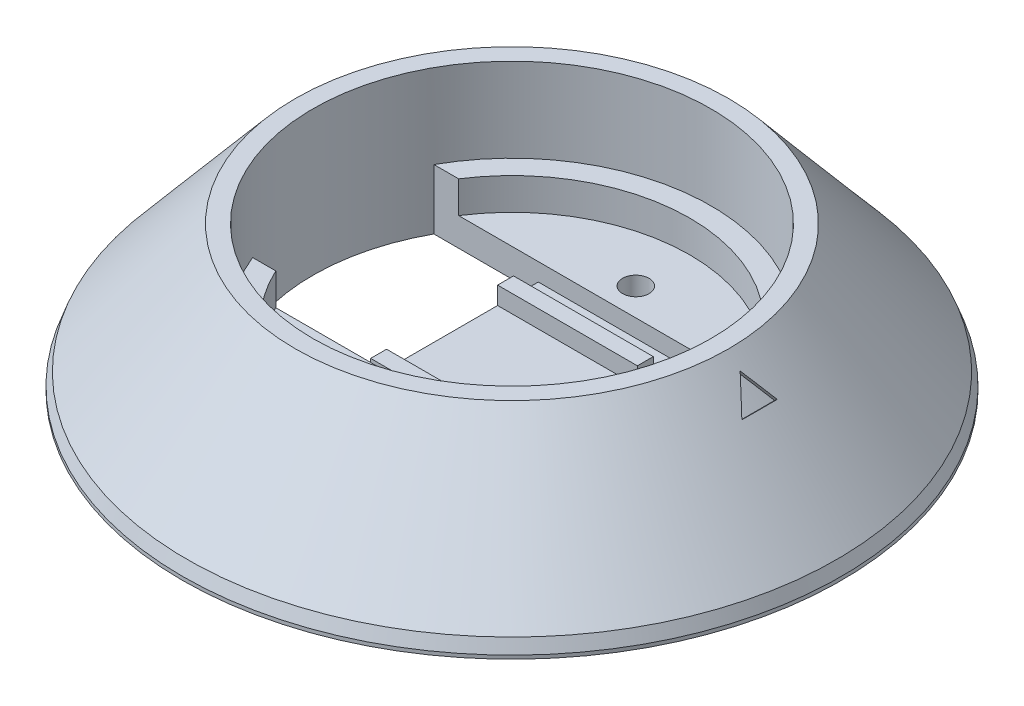
ISO-10303-21;
HEADER;
FILE_DESCRIPTION(('STEP AP214'),'2;1');
FILE_NAME('part.step','',(''),(''),'','','');
FILE_SCHEMA(('AUTOMOTIVE_DESIGN { 1 0 10303 214 1 1 1 1 }'));
ENDSEC;
DATA;
#1=APPLICATION_CONTEXT('core data for automotive mechanical design processes');
#2=APPLICATION_PROTOCOL_DEFINITION('international standard','automotive_design',2000,#1);
#3=PRODUCT_CONTEXT('',#1,'mechanical');
#4=PRODUCT('Part','Part','',(#3));
#5=PRODUCT_RELATED_PRODUCT_CATEGORY('part','',(#4));
#6=PRODUCT_DEFINITION_FORMATION('','',#4);
#7=PRODUCT_DEFINITION_CONTEXT('part definition',#1,'design');
#8=PRODUCT_DEFINITION('design','',#6,#7);
#9=PRODUCT_DEFINITION_SHAPE('','',#8);
#10=(LENGTH_UNIT() NAMED_UNIT(*) SI_UNIT(.MILLI.,.METRE.));
#11=(NAMED_UNIT(*) PLANE_ANGLE_UNIT() SI_UNIT($,.RADIAN.));
#12=(NAMED_UNIT(*) SI_UNIT($,.STERADIAN.) SOLID_ANGLE_UNIT());
#13=UNCERTAINTY_MEASURE_WITH_UNIT(LENGTH_MEASURE(1.E-05),#10,'distance_accuracy_value','');
#14=(GEOMETRIC_REPRESENTATION_CONTEXT(3) GLOBAL_UNCERTAINTY_ASSIGNED_CONTEXT((#13)) GLOBAL_UNIT_ASSIGNED_CONTEXT((#10,
#11,#12)) REPRESENTATION_CONTEXT('',''));
#15=CARTESIAN_POINT('',(0.,0.,0.));
#16=DIRECTION('',(0.,0.,1.));
#17=DIRECTION('',(1.,0.,0.));
#18=AXIS2_PLACEMENT_3D('',#15,#16,#17);
#19=CARTESIAN_POINT('',(0.,1.2,0.));
#20=DIRECTION('',(0.,1.,0.));
#21=DIRECTION('',(0.,0.,1.));
#22=AXIS2_PLACEMENT_3D('',#19,#20,#21);
#23=PLANE('',#22);
#24=DIRECTION('',(0.,0.,1.));
#25=VECTOR('',#24,1.);
#26=CARTESIAN_POINT('',(7.9,1.2,0.));
#27=LINE('',#26,#25);
#28=CARTESIAN_POINT('',(7.9,1.2,-10.875));
#29=VERTEX_POINT('',#28);
#30=CARTESIAN_POINT('',(7.9,1.2,-8.075));
#31=VERTEX_POINT('',#30);
#32=EDGE_CURVE('E489',#29,#31,#27,.T.);
#33=ORIENTED_EDGE('',*,*,#32,.F.);
#34=DIRECTION('',(1.,0.,0.));
#35=VECTOR('',#34,1.);
#36=CARTESIAN_POINT('',(0.,1.2,-10.875));
#37=LINE('',#36,#35);
#38=CARTESIAN_POINT('',(-7.9,1.2,-10.875));
#39=VERTEX_POINT('',#38);
#40=EDGE_CURVE('E386',#39,#29,#37,.T.);
#41=ORIENTED_EDGE('',*,*,#40,.F.);
#42=DIRECTION('',(0.,0.,1.));
#43=VECTOR('',#42,1.);
#44=CARTESIAN_POINT('',(-7.9,1.2,0.));
#45=LINE('',#44,#43);
#46=CARTESIAN_POINT('',(-7.9,1.2,-8.075));
#47=VERTEX_POINT('',#46);
#48=EDGE_CURVE('E437',#39,#47,#45,.T.);
#49=ORIENTED_EDGE('',*,*,#48,.T.);
#50=DIRECTION('',(1.,0.,0.));
#51=VECTOR('',#50,1.);
#52=CARTESIAN_POINT('',(0.,1.2,-8.075));
#53=LINE('',#52,#51);
#54=EDGE_CURVE('E379',#47,#31,#53,.T.);
#55=ORIENTED_EDGE('',*,*,#54,.T.);
#56=EDGE_LOOP('',(#33,#41,#49,#55));
#57=FACE_BOUND('',#56,.T.);
#58=ADVANCED_FACE('F74',(#57),#23,.T.);
#59=CARTESIAN_POINT('',(7.9,1.2,-6.275));
#60=VERTEX_POINT('',#59);
#61=CARTESIAN_POINT('',(7.9,1.2,6.275));
#62=VERTEX_POINT('',#61);
#63=EDGE_CURVE('E492',#60,#62,#27,.T.);
#64=ORIENTED_EDGE('',*,*,#63,.F.);
#65=DIRECTION('',(1.,0.,0.));
#66=VECTOR('',#65,1.);
#67=CARTESIAN_POINT('',(0.,1.2,-6.275));
#68=LINE('',#67,#66);
#69=CARTESIAN_POINT('',(-7.9,1.2,-6.275));
#70=VERTEX_POINT('',#69);
#71=EDGE_CURVE('E382',#70,#60,#68,.T.);
#72=ORIENTED_EDGE('',*,*,#71,.F.);
#73=CARTESIAN_POINT('',(-7.9,1.2,6.275));
#74=VERTEX_POINT('',#73);
#75=EDGE_CURVE('E441',#70,#74,#45,.T.);
#76=ORIENTED_EDGE('',*,*,#75,.T.);
#77=DIRECTION('',(1.,0.,0.));
#78=VECTOR('',#77,1.);
#79=CARTESIAN_POINT('',(-7.9,1.2,6.275));
#80=LINE('',#79,#78);
#81=EDGE_CURVE('E350',#74,#62,#80,.T.);
#82=ORIENTED_EDGE('',*,*,#81,.T.);
#83=EDGE_LOOP('',(#64,#72,#76,#82));
#84=FACE_BOUND('',#83,.T.);
#85=ADVANCED_FACE('F570',(#84),#23,.T.);
#86=CARTESIAN_POINT('',(0.,3.2,0.));
#87=DIRECTION('',(0.,1.,0.));
#88=DIRECTION('',(0.,0.,1.));
#89=AXIS2_PLACEMENT_3D('',#86,#87,#88);
#90=PLANE('',#89);
#91=DIRECTION('',(1.,0.,0.));
#92=VECTOR('',#91,1.);
#93=CARTESIAN_POINT('',(0.,3.2,-10.875));
#94=LINE('',#93,#92);
#95=CARTESIAN_POINT('',(-16.9039751242127,3.2,-10.875));
#96=VERTEX_POINT('',#95);
#97=CARTESIAN_POINT('',(16.9039751242126,3.2,-10.875));
#98=VERTEX_POINT('',#97);
#99=EDGE_CURVE('E396',#96,#98,#94,.T.);
#100=ORIENTED_EDGE('',*,*,#99,.T.);
#101=CARTESIAN_POINT('',(0.,3.2,0.));
#102=DIRECTION('',(0.,1.,0.));
#103=DIRECTION('',(0.,0.,1.));
#104=AXIS2_PLACEMENT_3D('',#101,#102,#103);
#105=CIRCLE('',#104,20.1);
#106=EDGE_CURVE('E334',#96,#98,#105,.F.);
#107=ORIENTED_EDGE('',*,*,#106,.F.);
#108=EDGE_LOOP('',(#100,#107));
#109=FACE_BOUND('',#108,.T.);
#110=CARTESIAN_POINT('',(0.,3.2,-14.));
#111=DIRECTION('',(0.,1.,0.));
#112=DIRECTION('',(0.,0.,1.));
#113=AXIS2_PLACEMENT_3D('',#110,#111,#112);
#114=CIRCLE('',#113,1.5);
#115=CARTESIAN_POINT('',(0.,3.2,-12.5));
#116=VERTEX_POINT('',#115);
#117=EDGE_CURVE('E480',#116,#116,#114,.T.);
#118=ORIENTED_EDGE('',*,*,#117,.F.);
#119=EDGE_LOOP('',(#118));
#120=FACE_BOUND('',#119,.T.);
#121=ADVANCED_FACE('F556',(#109,#120),#90,.T.);
#122=CARTESIAN_POINT('',(0.,6.8,0.));
#123=DIRECTION('',(0.,-1.,0.));
#124=DIRECTION('',(0.,0.,-1.));
#125=AXIS2_PLACEMENT_3D('',#122,#123,#124);
#126=CYLINDRICAL_SURFACE('',#125,20.1);
#127=DIRECTION('',(0.,-1.,0.));
#128=VECTOR('',#127,1.);
#129=CARTESIAN_POINT('',(16.9039751242126,6.8,-10.875));
#130=LINE('',#129,#128);
#131=CARTESIAN_POINT('',(16.9039751242126,6.8,-10.875));
#132=VERTEX_POINT('',#131);
#133=EDGE_CURVE('E477',#132,#98,#130,.T.);
#134=ORIENTED_EDGE('',*,*,#133,.F.);
#135=CARTESIAN_POINT('',(0.,6.8,0.));
#136=DIRECTION('',(0.,1.,0.));
#137=DIRECTION('',(0.,0.,1.));
#138=AXIS2_PLACEMENT_3D('',#135,#136,#137);
#139=CIRCLE('',#138,20.1);
#140=CARTESIAN_POINT('',(-16.9039751242127,6.8,-10.875));
#141=VERTEX_POINT('',#140);
#142=EDGE_CURVE('E329',#132,#141,#139,.T.);
#143=ORIENTED_EDGE('',*,*,#142,.T.);
#144=DIRECTION('',(0.,-1.,0.));
#145=VECTOR('',#144,1.);
#146=CARTESIAN_POINT('',(-16.9039751242127,6.8,-10.875));
#147=LINE('',#146,#145);
#148=EDGE_CURVE('E325',#96,#141,#147,.F.);
#149=ORIENTED_EDGE('',*,*,#148,.F.);
#150=ORIENTED_EDGE('',*,*,#106,.T.);
#151=EDGE_LOOP('',(#134,#143,#149,#150));
#152=FACE_BOUND('',#151,.T.);
#153=ADVANCED_FACE('F569',(#152),#126,.F.);
#154=CARTESIAN_POINT('',(0.,6.8,0.));
#155=DIRECTION('',(0.,1.,0.));
#156=DIRECTION('',(0.,0.,1.));
#157=AXIS2_PLACEMENT_3D('',#154,#155,#156);
#158=PLANE('',#157);
#159=DIRECTION('',(-1.,0.,0.));
#160=VECTOR('',#159,1.);
#161=CARTESIAN_POINT('',(7.9,6.8,-10.875));
#162=LINE('',#161,#160);
#163=CARTESIAN_POINT('',(19.6973189800033,6.8,-10.875));
#164=VERTEX_POINT('',#163);
#165=EDGE_CURVE('E253',#164,#132,#162,.T.);
#166=ORIENTED_EDGE('',*,*,#165,.F.);
#167=CARTESIAN_POINT('',(0.,6.8,0.));
#168=DIRECTION('',(0.,1.,0.));
#169=DIRECTION('',(0.,0.,1.));
#170=AXIS2_PLACEMENT_3D('',#167,#168,#169);
#171=CIRCLE('',#170,22.5);
#172=CARTESIAN_POINT('',(-19.6973189800033,6.8,-10.875));
#173=VERTEX_POINT('',#172);
#174=EDGE_CURVE('E326',#173,#164,#171,.F.);
#175=ORIENTED_EDGE('',*,*,#174,.F.);
#176=DIRECTION('',(-1.,0.,0.));
#177=VECTOR('',#176,1.);
#178=CARTESIAN_POINT('',(-7.9,6.8,-10.875));
#179=LINE('',#178,#177);
#180=EDGE_CURVE('E460',#141,#173,#179,.T.);
#181=ORIENTED_EDGE('',*,*,#180,.F.);
#182=ORIENTED_EDGE('',*,*,#142,.F.);
#183=EDGE_LOOP('',(#166,#175,#181,#182));
#184=FACE_BOUND('',#183,.T.);
#185=ADVANCED_FACE('F583',(#184),#158,.T.);
#186=CARTESIAN_POINT('',(7.9,1.2,8.075));
#187=VERTEX_POINT('',#186);
#188=CARTESIAN_POINT('',(7.9,1.2,8.475));
#189=VERTEX_POINT('',#188);
#190=EDGE_CURVE('E490',#187,#189,#27,.T.);
#191=ORIENTED_EDGE('',*,*,#190,.F.);
#192=DIRECTION('',(1.,0.,0.));
#193=VECTOR('',#192,1.);
#194=CARTESIAN_POINT('',(-7.9,1.2,8.075));
#195=LINE('',#194,#193);
#196=CARTESIAN_POINT('',(-7.9,1.2,8.075));
#197=VERTEX_POINT('',#196);
#198=EDGE_CURVE('E353',#197,#187,#195,.T.);
#199=ORIENTED_EDGE('',*,*,#198,.F.);
#200=CARTESIAN_POINT('',(-7.9,1.2,8.475));
#201=VERTEX_POINT('',#200);
#202=EDGE_CURVE('E438',#197,#201,#45,.T.);
#203=ORIENTED_EDGE('',*,*,#202,.T.);
#204=DIRECTION('',(1.,0.,0.));
#205=VECTOR('',#204,1.);
#206=CARTESIAN_POINT('',(0.,1.2,8.475));
#207=LINE('',#206,#205);
#208=EDGE_CURVE('E399',#201,#189,#207,.T.);
#209=ORIENTED_EDGE('',*,*,#208,.T.);
#210=EDGE_LOOP('',(#191,#199,#203,#209));
#211=FACE_BOUND('',#210,.T.);
#212=ADVANCED_FACE('F527',(#211),#23,.T.);
#213=CARTESIAN_POINT('',(0.,3.2,-10.875));
#214=DIRECTION('',(0.,0.,-1.));
#215=DIRECTION('',(-1.,0.,0.));
#216=AXIS2_PLACEMENT_3D('',#213,#214,#215);
#217=PLANE('',#216);
#218=ORIENTED_EDGE('',*,*,#40,.T.);
#219=DIRECTION('',(0.,1.,0.));
#220=VECTOR('',#219,1.);
#221=CARTESIAN_POINT('',(7.9,0.,-10.875));
#222=LINE('',#221,#220);
#223=CARTESIAN_POINT('',(7.9,0.,-10.875));
#224=VERTEX_POINT('',#223);
#225=EDGE_CURVE('E494',#224,#29,#222,.T.);
#226=ORIENTED_EDGE('',*,*,#225,.F.);
#227=DIRECTION('',(-1.,0.,0.));
#228=VECTOR('',#227,1.);
#229=CARTESIAN_POINT('',(7.9,0.,-10.875));
#230=LINE('',#229,#228);
#231=CARTESIAN_POINT('',(19.6973189800033,0.,-10.875));
#232=VERTEX_POINT('',#231);
#233=EDGE_CURVE('E266',#232,#224,#230,.T.);
#234=ORIENTED_EDGE('',*,*,#233,.F.);
#235=DIRECTION('',(0.,1.,0.));
#236=VECTOR('',#235,1.);
#237=CARTESIAN_POINT('',(19.6973189800033,0.,-10.875));
#238=LINE('',#237,#236);
#239=EDGE_CURVE('E493',#232,#164,#238,.T.);
#240=ORIENTED_EDGE('',*,*,#239,.T.);
#241=ORIENTED_EDGE('',*,*,#165,.T.);
#242=ORIENTED_EDGE('',*,*,#133,.T.);
#243=ORIENTED_EDGE('',*,*,#99,.F.);
#244=ORIENTED_EDGE('',*,*,#148,.T.);
#245=ORIENTED_EDGE('',*,*,#180,.T.);
#246=DIRECTION('',(0.,1.,0.));
#247=VECTOR('',#246,1.);
#248=CARTESIAN_POINT('',(-19.6973189800033,0.,-10.875));
#249=LINE('',#248,#247);
#250=CARTESIAN_POINT('',(-19.6973189800033,0.,-10.875));
#251=VERTEX_POINT('',#250);
#252=EDGE_CURVE('E446',#251,#173,#249,.T.);
#253=ORIENTED_EDGE('',*,*,#252,.F.);
#254=DIRECTION('',(-1.,0.,0.));
#255=VECTOR('',#254,1.);
#256=CARTESIAN_POINT('',(-7.9,0.,-10.875));
#257=LINE('',#256,#255);
#258=CARTESIAN_POINT('',(-7.9,0.,-10.875));
#259=VERTEX_POINT('',#258);
#260=EDGE_CURVE('E459',#259,#251,#257,.T.);
#261=ORIENTED_EDGE('',*,*,#260,.F.);
#262=DIRECTION('',(0.,1.,0.));
#263=VECTOR('',#262,1.);
#264=CARTESIAN_POINT('',(-7.9,0.,-10.875));
#265=LINE('',#264,#263);
#266=EDGE_CURVE('E445',#259,#39,#265,.T.);
#267=ORIENTED_EDGE('',*,*,#266,.T.);
#268=EDGE_LOOP('',(#218,#226,#234,#240,#241,#242,#243,#244,#245,#253,#261,#267));
#269=FACE_BOUND('',#268,.T.);
#270=ADVANCED_FACE('F515',(#269),#217,.F.);
#271=CARTESIAN_POINT('',(0.,3.2,8.475));
#272=DIRECTION('',(0.,0.,-1.));
#273=DIRECTION('',(-1.,0.,0.));
#274=AXIS2_PLACEMENT_3D('',#271,#272,#273);
#275=PLANE('',#274);
#276=DIRECTION('',(1.,0.,0.));
#277=VECTOR('',#276,1.);
#278=CARTESIAN_POINT('',(0.,3.2,8.475));
#279=LINE('',#278,#277);
#280=CARTESIAN_POINT('',(-18.2259259024062,3.2,8.475));
#281=VERTEX_POINT('',#280);
#282=CARTESIAN_POINT('',(18.2259259024062,3.2,8.475));
#283=VERTEX_POINT('',#282);
#284=EDGE_CURVE('E398',#281,#283,#279,.T.);
#285=ORIENTED_EDGE('',*,*,#284,.T.);
#286=DIRECTION('',(0.,-1.,0.));
#287=VECTOR('',#286,1.);
#288=CARTESIAN_POINT('',(18.2259259024062,6.8,8.475));
#289=LINE('',#288,#287);
#290=CARTESIAN_POINT('',(18.2259259024062,6.8,8.475));
#291=VERTEX_POINT('',#290);
#292=EDGE_CURVE('E487',#283,#291,#289,.F.);
#293=ORIENTED_EDGE('',*,*,#292,.T.);
#294=DIRECTION('',(1.,0.,0.));
#295=VECTOR('',#294,1.);
#296=CARTESIAN_POINT('',(20.8428494932915,6.8,8.475));
#297=LINE('',#296,#295);
#298=CARTESIAN_POINT('',(20.8428494932915,6.8,8.475));
#299=VERTEX_POINT('',#298);
#300=EDGE_CURVE('E255',#291,#299,#297,.T.);
#301=ORIENTED_EDGE('',*,*,#300,.T.);
#302=DIRECTION('',(0.,1.,0.));
#303=VECTOR('',#302,1.);
#304=CARTESIAN_POINT('',(20.8428494932915,0.,8.475));
#305=LINE('',#304,#303);
#306=CARTESIAN_POINT('',(20.8428494932915,0.,8.475));
#307=VERTEX_POINT('',#306);
#308=EDGE_CURVE('E102',#307,#299,#305,.T.);
#309=ORIENTED_EDGE('',*,*,#308,.F.);
#310=DIRECTION('',(1.,0.,0.));
#311=VECTOR('',#310,1.);
#312=CARTESIAN_POINT('',(20.8428494932915,0.,8.475));
#313=LINE('',#312,#311);
#314=CARTESIAN_POINT('',(7.9,0.,8.475));
#315=VERTEX_POINT('',#314);
#316=EDGE_CURVE('E505',#315,#307,#313,.T.);
#317=ORIENTED_EDGE('',*,*,#316,.F.);
#318=DIRECTION('',(0.,1.,0.));
#319=VECTOR('',#318,1.);
#320=CARTESIAN_POINT('',(7.9,0.,8.475));
#321=LINE('',#320,#319);
#322=EDGE_CURVE('E496',#315,#189,#321,.T.);
#323=ORIENTED_EDGE('',*,*,#322,.T.);
#324=ORIENTED_EDGE('',*,*,#208,.F.);
#325=DIRECTION('',(0.,1.,0.));
#326=VECTOR('',#325,1.);
#327=CARTESIAN_POINT('',(-7.9,0.,8.475));
#328=LINE('',#327,#326);
#329=CARTESIAN_POINT('',(-7.9,0.,8.475));
#330=VERTEX_POINT('',#329);
#331=EDGE_CURVE('E452',#330,#201,#328,.T.);
#332=ORIENTED_EDGE('',*,*,#331,.F.);
#333=DIRECTION('',(-1.,0.,0.));
#334=VECTOR('',#333,1.);
#335=CARTESIAN_POINT('',(-7.9,0.,8.475));
#336=LINE('',#335,#334);
#337=CARTESIAN_POINT('',(-20.8428494932915,0.,8.475));
#338=VERTEX_POINT('',#337);
#339=EDGE_CURVE('E465',#330,#338,#336,.T.);
#340=ORIENTED_EDGE('',*,*,#339,.T.);
#341=DIRECTION('',(0.,1.,0.));
#342=VECTOR('',#341,1.);
#343=CARTESIAN_POINT('',(-20.8428494932915,0.,8.475));
#344=LINE('',#343,#342);
#345=CARTESIAN_POINT('',(-20.8428494932915,6.8,8.475));
#346=VERTEX_POINT('',#345);
#347=EDGE_CURVE('E448',#338,#346,#344,.T.);
#348=ORIENTED_EDGE('',*,*,#347,.T.);
#349=DIRECTION('',(-1.,0.,0.));
#350=VECTOR('',#349,1.);
#351=CARTESIAN_POINT('',(-7.9,6.8,8.475));
#352=LINE('',#351,#350);
#353=CARTESIAN_POINT('',(-18.2259259024062,6.8,8.475));
#354=VERTEX_POINT('',#353);
#355=EDGE_CURVE('E456',#354,#346,#352,.T.);
#356=ORIENTED_EDGE('',*,*,#355,.F.);
#357=DIRECTION('',(0.,-1.,0.));
#358=VECTOR('',#357,1.);
#359=CARTESIAN_POINT('',(-18.2259259024062,6.8,8.475));
#360=LINE('',#359,#358);
#361=EDGE_CURVE('E442',#281,#354,#360,.F.);
#362=ORIENTED_EDGE('',*,*,#361,.F.);
#363=EDGE_LOOP('',(#285,#293,#301,#309,#317,#323,#324,#332,#340,#348,#356,#362));
#364=FACE_BOUND('',#363,.T.);
#365=ADVANCED_FACE('F524',(#364),#275,.T.);
#366=EDGE_CURVE('E333',#283,#281,#105,.F.);
#367=ORIENTED_EDGE('',*,*,#366,.F.);
#368=ORIENTED_EDGE('',*,*,#284,.F.);
#369=EDGE_LOOP('',(#367,#368));
#370=FACE_BOUND('',#369,.T.);
#371=CARTESIAN_POINT('',(0.,3.2,14.));
#372=DIRECTION('',(0.,1.,0.));
#373=DIRECTION('',(0.,0.,-1.));
#374=AXIS2_PLACEMENT_3D('',#371,#372,#373);
#375=CIRCLE('',#374,1.5);
#376=CARTESIAN_POINT('',(0.,3.2,15.5));
#377=VERTEX_POINT('',#376);
#378=EDGE_CURVE('E473',#377,#377,#375,.T.);
#379=ORIENTED_EDGE('',*,*,#378,.F.);
#380=EDGE_LOOP('',(#379));
#381=FACE_BOUND('',#380,.T.);
#382=ADVANCED_FACE('F551',(#370,#381),#90,.T.);
#383=CARTESIAN_POINT('',(0.,3.2,-6.275));
#384=DIRECTION('',(0.,0.,-1.));
#385=DIRECTION('',(-1.,0.,0.));
#386=AXIS2_PLACEMENT_3D('',#383,#384,#385);
#387=PLANE('',#386);
#388=ORIENTED_EDGE('',*,*,#71,.T.);
#389=DIRECTION('',(0.,-1.,0.));
#390=VECTOR('',#389,1.);
#391=CARTESIAN_POINT('',(7.9,3.2,-6.275));
#392=LINE('',#391,#390);
#393=CARTESIAN_POINT('',(7.9,3.2,-6.275));
#394=VERTEX_POINT('',#393);
#395=EDGE_CURVE('E357',#394,#60,#392,.T.);
#396=ORIENTED_EDGE('',*,*,#395,.F.);
#397=DIRECTION('',(1.,0.,0.));
#398=VECTOR('',#397,1.);
#399=CARTESIAN_POINT('',(0.,3.2,-6.275));
#400=LINE('',#399,#398);
#401=CARTESIAN_POINT('',(-7.9,3.2,-6.275));
#402=VERTEX_POINT('',#401);
#403=EDGE_CURVE('E383',#402,#394,#400,.T.);
#404=ORIENTED_EDGE('',*,*,#403,.F.);
#405=DIRECTION('',(0.,-1.,0.));
#406=VECTOR('',#405,1.);
#407=CARTESIAN_POINT('',(-7.9,3.2,-6.275));
#408=LINE('',#407,#406);
#409=EDGE_CURVE('E375',#402,#70,#408,.T.);
#410=ORIENTED_EDGE('',*,*,#409,.T.);
#411=EDGE_LOOP('',(#388,#396,#404,#410));
#412=FACE_BOUND('',#411,.T.);
#413=ADVANCED_FACE('F554',(#412),#387,.F.);
#414=CARTESIAN_POINT('',(7.9,3.2,0.));
#415=DIRECTION('',(-1.,0.,0.));
#416=DIRECTION('',(0.,0.,1.));
#417=AXIS2_PLACEMENT_3D('',#414,#415,#416);
#418=PLANE('',#417);
#419=ORIENTED_EDGE('',*,*,#395,.T.);
#420=ORIENTED_EDGE('',*,*,#63,.T.);
#421=DIRECTION('',(0.,-1.,0.));
#422=VECTOR('',#421,1.);
#423=CARTESIAN_POINT('',(7.9,3.2,6.275));
#424=LINE('',#423,#422);
#425=CARTESIAN_POINT('',(7.9,3.2,6.275));
#426=VERTEX_POINT('',#425);
#427=EDGE_CURVE('E343',#426,#62,#424,.T.);
#428=ORIENTED_EDGE('',*,*,#427,.F.);
#429=DIRECTION('',(0.,0.,1.));
#430=VECTOR('',#429,1.);
#431=CARTESIAN_POINT('',(7.9,3.2,6.275));
#432=LINE('',#431,#430);
#433=CARTESIAN_POINT('',(7.9,3.2,8.075));
#434=VERTEX_POINT('',#433);
#435=EDGE_CURVE('E360',#426,#434,#432,.T.);
#436=ORIENTED_EDGE('',*,*,#435,.T.);
#437=DIRECTION('',(0.,-1.,0.));
#438=VECTOR('',#437,1.);
#439=CARTESIAN_POINT('',(7.9,3.2,8.075));
#440=LINE('',#439,#438);
#441=EDGE_CURVE('E340',#434,#187,#440,.T.);
#442=ORIENTED_EDGE('',*,*,#441,.T.);
#443=ORIENTED_EDGE('',*,*,#190,.T.);
#444=ORIENTED_EDGE('',*,*,#322,.F.);
#445=DIRECTION('',(0.,0.,1.));
#446=VECTOR('',#445,1.);
#447=CARTESIAN_POINT('',(7.9,0.,-10.875));
#448=LINE('',#447,#446);
#449=EDGE_CURVE('E507',#224,#315,#448,.T.);
#450=ORIENTED_EDGE('',*,*,#449,.F.);
#451=ORIENTED_EDGE('',*,*,#225,.T.);
#452=ORIENTED_EDGE('',*,*,#32,.T.);
#453=DIRECTION('',(0.,-1.,0.));
#454=VECTOR('',#453,1.);
#455=CARTESIAN_POINT('',(7.9,3.2,-8.075));
#456=LINE('',#455,#454);
#457=CARTESIAN_POINT('',(7.9,3.2,-8.075));
#458=VERTEX_POINT('',#457);
#459=EDGE_CURVE('E369',#458,#31,#456,.T.);
#460=ORIENTED_EDGE('',*,*,#459,.F.);
#461=DIRECTION('',(0.,0.,-1.));
#462=VECTOR('',#461,1.);
#463=CARTESIAN_POINT('',(7.9,3.2,0.));
#464=LINE('',#463,#462);
#465=EDGE_CURVE('E392',#394,#458,#464,.T.);
#466=ORIENTED_EDGE('',*,*,#465,.F.);
#467=EDGE_LOOP('',(#419,#420,#428,#436,#442,#443,#444,#450,#451,#452,#460,#466));
#468=FACE_BOUND('',#467,.T.);
#469=ADVANCED_FACE('F521',(#468),#418,.F.);
#470=CARTESIAN_POINT('',(0.,3.2,-8.075));
#471=DIRECTION('',(0.,0.,-1.));
#472=DIRECTION('',(-1.,0.,0.));
#473=AXIS2_PLACEMENT_3D('',#470,#471,#472);
#474=PLANE('',#473);
#475=ORIENTED_EDGE('',*,*,#54,.F.);
#476=DIRECTION('',(0.,-1.,0.));
#477=VECTOR('',#476,1.);
#478=CARTESIAN_POINT('',(-7.9,3.2,-8.075));
#479=LINE('',#478,#477);
#480=CARTESIAN_POINT('',(-7.9,3.2,-8.075));
#481=VERTEX_POINT('',#480);
#482=EDGE_CURVE('E372',#481,#47,#479,.T.);
#483=ORIENTED_EDGE('',*,*,#482,.F.);
#484=DIRECTION('',(1.,0.,0.));
#485=VECTOR('',#484,1.);
#486=CARTESIAN_POINT('',(0.,3.2,-8.075));
#487=LINE('',#486,#485);
#488=EDGE_CURVE('E389',#481,#458,#487,.T.);
#489=ORIENTED_EDGE('',*,*,#488,.T.);
#490=ORIENTED_EDGE('',*,*,#459,.T.);
#491=EDGE_LOOP('',(#475,#483,#489,#490));
#492=FACE_BOUND('',#491,.T.);
#493=ADVANCED_FACE('F618',(#492),#474,.T.);
#494=CARTESIAN_POINT('',(-7.9,3.2,0.));
#495=DIRECTION('',(-1.,0.,0.));
#496=DIRECTION('',(0.,0.,1.));
#497=AXIS2_PLACEMENT_3D('',#494,#495,#496);
#498=PLANE('',#497);
#499=ORIENTED_EDGE('',*,*,#482,.T.);
#500=ORIENTED_EDGE('',*,*,#48,.F.);
#501=ORIENTED_EDGE('',*,*,#266,.F.);
#502=DIRECTION('',(0.,0.,1.));
#503=VECTOR('',#502,1.);
#504=CARTESIAN_POINT('',(-7.9,0.,-10.875));
#505=LINE('',#504,#503);
#506=EDGE_CURVE('E449',#259,#330,#505,.T.);
#507=ORIENTED_EDGE('',*,*,#506,.T.);
#508=ORIENTED_EDGE('',*,*,#331,.T.);
#509=ORIENTED_EDGE('',*,*,#202,.F.);
#510=DIRECTION('',(0.,-1.,0.));
#511=VECTOR('',#510,1.);
#512=CARTESIAN_POINT('',(-7.9,3.2,8.075));
#513=LINE('',#512,#511);
#514=CARTESIAN_POINT('',(-7.9,3.2,8.075));
#515=VERTEX_POINT('',#514);
#516=EDGE_CURVE('E337',#515,#197,#513,.T.);
#517=ORIENTED_EDGE('',*,*,#516,.F.);
#518=DIRECTION('',(0.,0.,1.));
#519=VECTOR('',#518,1.);
#520=CARTESIAN_POINT('',(-7.9,3.2,6.275));
#521=LINE('',#520,#519);
#522=CARTESIAN_POINT('',(-7.9,3.2,6.275));
#523=VERTEX_POINT('',#522);
#524=EDGE_CURVE('E354',#523,#515,#521,.T.);
#525=ORIENTED_EDGE('',*,*,#524,.F.);
#526=DIRECTION('',(0.,-1.,0.));
#527=VECTOR('',#526,1.);
#528=CARTESIAN_POINT('',(-7.9,3.2,6.275));
#529=LINE('',#528,#527);
#530=EDGE_CURVE('E346',#523,#74,#529,.T.);
#531=ORIENTED_EDGE('',*,*,#530,.T.);
#532=ORIENTED_EDGE('',*,*,#75,.F.);
#533=ORIENTED_EDGE('',*,*,#409,.F.);
#534=DIRECTION('',(0.,0.,-1.));
#535=VECTOR('',#534,1.);
#536=CARTESIAN_POINT('',(-7.9,3.2,0.));
#537=LINE('',#536,#535);
#538=EDGE_CURVE('E378',#402,#481,#537,.T.);
#539=ORIENTED_EDGE('',*,*,#538,.T.);
#540=EDGE_LOOP('',(#499,#500,#501,#507,#508,#509,#517,#525,#531,#532,#533,#539));
#541=FACE_BOUND('',#540,.T.);
#542=ADVANCED_FACE('F531',(#541),#498,.T.);
#543=CARTESIAN_POINT('',(0.,3.2,0.));
#544=DIRECTION('',(0.,1.,0.));
#545=DIRECTION('',(0.,0.,1.));
#546=AXIS2_PLACEMENT_3D('',#543,#544,#545);
#547=PLANE('',#546);
#548=ORIENTED_EDGE('',*,*,#403,.T.);
#549=ORIENTED_EDGE('',*,*,#465,.T.);
#550=ORIENTED_EDGE('',*,*,#488,.F.);
#551=ORIENTED_EDGE('',*,*,#538,.F.);
#552=EDGE_LOOP('',(#548,#549,#550,#551));
#553=FACE_BOUND('',#552,.T.);
#554=ADVANCED_FACE('F612',(#553),#547,.T.);
#555=CARTESIAN_POINT('',(-7.9,3.2,8.075));
#556=DIRECTION('',(0.,0.,-1.));
#557=DIRECTION('',(-1.,0.,0.));
#558=AXIS2_PLACEMENT_3D('',#555,#556,#557);
#559=PLANE('',#558);
#560=ORIENTED_EDGE('',*,*,#198,.T.);
#561=ORIENTED_EDGE('',*,*,#441,.F.);
#562=DIRECTION('',(1.,0.,0.));
#563=VECTOR('',#562,1.);
#564=CARTESIAN_POINT('',(-7.9,3.2,8.075));
#565=LINE('',#564,#563);
#566=EDGE_CURVE('E363',#515,#434,#565,.T.);
#567=ORIENTED_EDGE('',*,*,#566,.F.);
#568=ORIENTED_EDGE('',*,*,#516,.T.);
#569=EDGE_LOOP('',(#560,#561,#567,#568));
#570=FACE_BOUND('',#569,.T.);
#571=ADVANCED_FACE('F609',(#570),#559,.F.);
#572=CARTESIAN_POINT('',(-7.9,3.2,6.275));
#573=DIRECTION('',(0.,0.,-1.));
#574=DIRECTION('',(-1.,0.,0.));
#575=AXIS2_PLACEMENT_3D('',#572,#573,#574);
#576=PLANE('',#575);
#577=ORIENTED_EDGE('',*,*,#81,.F.);
#578=ORIENTED_EDGE('',*,*,#530,.F.);
#579=DIRECTION('',(1.,0.,0.));
#580=VECTOR('',#579,1.);
#581=CARTESIAN_POINT('',(-7.9,3.2,6.275));
#582=LINE('',#581,#580);
#583=EDGE_CURVE('E349',#523,#426,#582,.T.);
#584=ORIENTED_EDGE('',*,*,#583,.T.);
#585=ORIENTED_EDGE('',*,*,#427,.T.);
#586=EDGE_LOOP('',(#577,#578,#584,#585));
#587=FACE_BOUND('',#586,.T.);
#588=ADVANCED_FACE('F605',(#587),#576,.T.);
#589=CARTESIAN_POINT('',(0.,3.2,0.));
#590=DIRECTION('',(0.,1.,0.));
#591=DIRECTION('',(0.,0.,1.));
#592=AXIS2_PLACEMENT_3D('',#589,#590,#591);
#593=PLANE('',#592);
#594=ORIENTED_EDGE('',*,*,#524,.T.);
#595=ORIENTED_EDGE('',*,*,#566,.T.);
#596=ORIENTED_EDGE('',*,*,#435,.F.);
#597=ORIENTED_EDGE('',*,*,#583,.F.);
#598=EDGE_LOOP('',(#594,#595,#596,#597));
#599=FACE_BOUND('',#598,.T.);
#600=ADVANCED_FACE('F600',(#599),#593,.T.);
#601=ORIENTED_EDGE('',*,*,#292,.F.);
#602=ORIENTED_EDGE('',*,*,#366,.T.);
#603=ORIENTED_EDGE('',*,*,#361,.T.);
#604=EDGE_CURVE('E330',#354,#291,#139,.T.);
#605=ORIENTED_EDGE('',*,*,#604,.T.);
#606=EDGE_LOOP('',(#601,#602,#603,#605));
#607=FACE_BOUND('',#606,.T.);
#608=ADVANCED_FACE('F547',(#607),#126,.F.);
#609=ORIENTED_EDGE('',*,*,#300,.F.);
#610=ORIENTED_EDGE('',*,*,#604,.F.);
#611=ORIENTED_EDGE('',*,*,#355,.T.);
#612=EDGE_CURVE('E319',#299,#346,#171,.F.);
#613=ORIENTED_EDGE('',*,*,#612,.F.);
#614=EDGE_LOOP('',(#609,#610,#611,#613));
#615=FACE_BOUND('',#614,.T.);
#616=ADVANCED_FACE('F301',(#615),#158,.T.);
#617=CARTESIAN_POINT('',(0.,16.3,0.));
#618=DIRECTION('',(0.,1.,0.));
#619=DIRECTION('',(0.,0.,1.));
#620=AXIS2_PLACEMENT_3D('',#617,#618,#619);
#621=PLANE('',#620);
#622=CARTESIAN_POINT('',(0.,16.3,0.));
#623=DIRECTION('',(0.,1.,0.));
#624=DIRECTION('',(0.,0.,1.));
#625=AXIS2_PLACEMENT_3D('',#622,#623,#624);
#626=CIRCLE('',#625,22.5);
#627=CARTESIAN_POINT('',(0.,16.3,22.5));
#628=VERTEX_POINT('',#627);
#629=EDGE_CURVE('E320',#628,#628,#626,.F.);
#630=ORIENTED_EDGE('',*,*,#629,.T.);
#631=EDGE_LOOP('',(#630));
#632=FACE_BOUND('',#631,.T.);
#633=CARTESIAN_POINT('',(0.,16.3,0.));
#634=DIRECTION('',(0.,1.,0.));
#635=DIRECTION('',(0.,0.,1.));
#636=AXIS2_PLACEMENT_3D('',#633,#634,#635);
#637=CIRCLE('',#636,24.5);
#638=CARTESIAN_POINT('',(0.,16.3,24.5));
#639=VERTEX_POINT('',#638);
#640=EDGE_CURVE('E312',#639,#639,#637,.T.);
#641=ORIENTED_EDGE('',*,*,#640,.T.);
#642=EDGE_LOOP('',(#641));
#643=FACE_BOUND('',#642,.T.);
#644=ADVANCED_FACE('F298',(#632,#643),#621,.T.);
#645=CARTESIAN_POINT('',(0.,16.3,0.));
#646=DIRECTION('',(0.,-1.,0.));
#647=DIRECTION('',(0.,0.,-1.));
#648=AXIS2_PLACEMENT_3D('',#645,#646,#647);
#649=CONICAL_SURFACE('',#648,24.5,0.701216967539844);
#650=CARTESIAN_POINT('',(27.9836993737428,12.0896548297801,-2.00019999999999));
#651=CARTESIAN_POINT('',(27.8041351019331,12.3158438282706,-1.83353805270801));
#652=CARTESIAN_POINT('',(27.623823472477,12.5414311340102,-1.66686315640055));
#653=CARTESIAN_POINT('',(27.2616217778644,12.9913035890589,-1.33349985259006));
#654=CARTESIAN_POINT('',(27.0797317804834,13.2155887935971,-1.16681144596868));
#655=CARTESIAN_POINT('',(26.714273400043,13.6627787214926,-0.833418443834531));
#656=CARTESIAN_POINT('',(26.5307050087242,13.8856834380474,-0.666713848246103));
#657=CARTESIAN_POINT('',(26.1617805456536,14.3300182039802,-0.333289306627119));
#658=CARTESIAN_POINT('',(25.9764243978356,14.5514481899271,-0.166569360245009));
#659=CARTESIAN_POINT('',(25.7901271215382,14.7720847418107,0.000151127579210665));
#660=B_SPLINE_CURVE_WITH_KNOTS('',3,(#650,#651,#652,#653,#654,#655,#656,#657,#658,#659),
.UNSPECIFIED.,.F.,.F.,(4,2,2,2,4),(0.,1.00031417121082,2.00058559913616,3.00086195201459,
4.00118105439993),.UNSPECIFIED.);
#661=CARTESIAN_POINT('',(27.9834838916777,12.089926265246,-1.99999999999999));
#662=VERTEX_POINT('',#661);
#663=CARTESIAN_POINT('',(25.7902959961532,14.7718847418107,0.));
#664=VERTEX_POINT('',#663);
#665=EDGE_CURVE('E13',#662,#664,#660,.T.);
#666=ORIENTED_EDGE('',*,*,#665,.F.);
#667=CARTESIAN_POINT('',(-69.6105906659737,-70.3156664903868,0.));
#668=DIRECTION('',(0.645147998076611,-0.764057629094652,0.));
#669=DIRECTION('',(-0.764057629094652,-0.645147998076611,0.));
#670=AXIS2_PLACEMENT_3D('',#667,#668,#669);
#671=ELLIPSE('',#670,127.785838615286,68.4624301806467);
#672=CARTESIAN_POINT('',(27.9834838916777,12.089926265246,2.00000000000001));
#673=VERTEX_POINT('',#672);
#674=EDGE_CURVE('E88',#673,#662,#671,.F.);
#675=ORIENTED_EDGE('',*,*,#674,.F.);
#676=CARTESIAN_POINT('',(25.7901271215382,14.7720847418107,-0.000151127579196658));
#677=CARTESIAN_POINT('',(25.9764243978356,14.5514481899271,0.166569360245021));
#678=CARTESIAN_POINT('',(26.1617805456536,14.3300182039802,0.333289306627131));
#679=CARTESIAN_POINT('',(26.5307050087242,13.8856834380474,0.666713848246114));
#680=CARTESIAN_POINT('',(26.714273400043,13.6627787214926,0.833418443834542));
#681=CARTESIAN_POINT('',(27.0797317804834,13.2155887935971,1.16681144596869));
#682=CARTESIAN_POINT('',(27.2616217778644,12.9913035890589,1.33349985259008));
#683=CARTESIAN_POINT('',(27.623823472477,12.5414311340102,1.66686315640057));
#684=CARTESIAN_POINT('',(27.8041351019331,12.3158438282706,1.83353805270802));
#685=CARTESIAN_POINT('',(27.9836993737428,12.0896548297801,2.00020000000001));
#686=B_SPLINE_CURVE_WITH_KNOTS('',3,(#676,#677,#678,#679,#680,#681,#682,#683,#684,#685),
.UNSPECIFIED.,.F.,.F.,(4,2,2,2,4),(0.,1.00031910238534,2.00059545526377,3.00086688318911,
4.00118105439993),.UNSPECIFIED.);
#687=EDGE_CURVE('E250',#664,#673,#686,.T.);
#688=ORIENTED_EDGE('',*,*,#687,.F.);
#689=EDGE_LOOP('',(#666,#675,#688));
#690=FACE_BOUND('',#689,.T.);
#691=CARTESIAN_POINT('',(0.,1.80611117316146,0.));
#692=DIRECTION('',(0.,-1.,0.));
#693=DIRECTION('',(0.,0.,-1.));
#694=AXIS2_PLACEMENT_3D('',#691,#692,#693);
#695=CIRCLE('',#694,36.7382173869001);
#696=CARTESIAN_POINT('',(0.,1.80611117316146,-36.7382173869001));
#697=VERTEX_POINT('',#696);
#698=EDGE_CURVE('E408',#697,#697,#695,.F.);
#699=ORIENTED_EDGE('',*,*,#698,.T.);
#700=EDGE_LOOP('',(#699));
#701=FACE_BOUND('',#700,.T.);
#702=ORIENTED_EDGE('',*,*,#640,.F.);
#703=EDGE_LOOP('',(#702));
#704=FACE_BOUND('',#703,.T.);
#705=ADVANCED_FACE('F297',(#690,#701,#704),#649,.T.);
#706=CARTESIAN_POINT('',(0.,16.3001,0.));
#707=DIRECTION('',(0.,-1.,0.));
#708=DIRECTION('',(0.,0.,-1.));
#709=AXIS2_PLACEMENT_3D('',#706,#707,#708);
#710=CYLINDRICAL_SURFACE('',#709,22.5);
#711=ORIENTED_EDGE('',*,*,#174,.T.);
#712=ORIENTED_EDGE('',*,*,#239,.F.);
#713=CARTESIAN_POINT('',(0.,0.,0.));
#714=DIRECTION('',(0.,1.,0.));
#715=DIRECTION('',(0.,0.,1.));
#716=AXIS2_PLACEMENT_3D('',#713,#714,#715);
#717=CIRCLE('',#716,22.5);
#718=EDGE_CURVE('E497',#307,#232,#717,.T.);
#719=ORIENTED_EDGE('',*,*,#718,.F.);
#720=ORIENTED_EDGE('',*,*,#308,.T.);
#721=ORIENTED_EDGE('',*,*,#612,.T.);
#722=ORIENTED_EDGE('',*,*,#347,.F.);
#723=CARTESIAN_POINT('',(0.,0.,0.));
#724=DIRECTION('',(0.,1.,0.));
#725=DIRECTION('',(0.,0.,1.));
#726=AXIS2_PLACEMENT_3D('',#723,#724,#725);
#727=CIRCLE('',#726,22.5);
#728=EDGE_CURVE('E468',#251,#338,#727,.T.);
#729=ORIENTED_EDGE('',*,*,#728,.F.);
#730=ORIENTED_EDGE('',*,*,#252,.T.);
#731=EDGE_LOOP('',(#711,#712,#719,#720,#721,#722,#729,#730));
#732=FACE_BOUND('',#731,.T.);
#733=ORIENTED_EDGE('',*,*,#629,.F.);
#734=EDGE_LOOP('',(#733));
#735=FACE_BOUND('',#734,.T.);
#736=ADVANCED_FACE('F293',(#732,#735),#710,.F.);
#737=CARTESIAN_POINT('',(0.,0.,0.));
#738=DIRECTION('',(0.,1.,0.));
#739=DIRECTION('',(0.,0.,1.));
#740=AXIS2_PLACEMENT_3D('',#737,#738,#739);
#741=PLANE('',#740);
#742=ORIENTED_EDGE('',*,*,#718,.T.);
#743=ORIENTED_EDGE('',*,*,#233,.T.);
#744=ORIENTED_EDGE('',*,*,#449,.T.);
#745=ORIENTED_EDGE('',*,*,#316,.T.);
#746=EDGE_LOOP('',(#742,#743,#744,#745));
#747=FACE_BOUND('',#746,.T.);
#748=CARTESIAN_POINT('',(0.,0.,-14.));
#749=DIRECTION('',(0.,1.,0.));
#750=DIRECTION('',(0.,0.,1.));
#751=AXIS2_PLACEMENT_3D('',#748,#749,#750);
#752=CIRCLE('',#751,1.5);
#753=CARTESIAN_POINT('',(0.,0.,-12.5));
#754=VERTEX_POINT('',#753);
#755=EDGE_CURVE('E463',#754,#754,#752,.T.);
#756=ORIENTED_EDGE('',*,*,#755,.T.);
#757=EDGE_LOOP('',(#756));
#758=FACE_BOUND('',#757,.T.);
#759=CARTESIAN_POINT('',(0.,0.,14.));
#760=DIRECTION('',(0.,1.,0.));
#761=DIRECTION('',(0.,0.,-1.));
#762=AXIS2_PLACEMENT_3D('',#759,#760,#761);
#763=CIRCLE('',#762,1.5);
#764=CARTESIAN_POINT('',(0.,0.,15.5));
#765=VERTEX_POINT('',#764);
#766=EDGE_CURVE('E476',#765,#765,#763,.T.);
#767=ORIENTED_EDGE('',*,*,#766,.T.);
#768=EDGE_LOOP('',(#767));
#769=FACE_BOUND('',#768,.T.);
#770=ORIENTED_EDGE('',*,*,#506,.F.);
#771=ORIENTED_EDGE('',*,*,#260,.T.);
#772=ORIENTED_EDGE('',*,*,#728,.T.);
#773=ORIENTED_EDGE('',*,*,#339,.F.);
#774=EDGE_LOOP('',(#770,#771,#772,#773));
#775=FACE_BOUND('',#774,.T.);
#776=CARTESIAN_POINT('',(0.,0.,0.));
#777=DIRECTION('',(0.,1.,0.));
#778=DIRECTION('',(0.,0.,1.));
#779=AXIS2_PLACEMENT_3D('',#776,#777,#778);
#780=CIRCLE('',#779,37.25);
#781=CARTESIAN_POINT('',(0.,0.,37.25));
#782=VERTEX_POINT('',#781);
#783=EDGE_CURVE('E401',#782,#782,#780,.T.);
#784=ORIENTED_EDGE('',*,*,#783,.F.);
#785=EDGE_LOOP('',(#784));
#786=FACE_BOUND('',#785,.T.);
#787=ADVANCED_FACE('F296',(#747,#758,#769,#775,#786),#741,.F.);
#788=CARTESIAN_POINT('',(0.,1.2,0.));
#789=DIRECTION('',(0.,-1.,0.));
#790=DIRECTION('',(0.,0.,-1.));
#791=AXIS2_PLACEMENT_3D('',#788,#789,#790);
#792=CYLINDRICAL_SURFACE('',#791,37.25);
#793=CARTESIAN_POINT('',(0.,0.399999999999953,0.));
#794=DIRECTION('',(0.,1.,0.));
#795=DIRECTION('',(0.,0.,1.));
#796=AXIS2_PLACEMENT_3D('',#793,#794,#795);
#797=CIRCLE('',#796,37.25);
#798=CARTESIAN_POINT('',(0.,0.399999999999953,37.25));
#799=VERTEX_POINT('',#798);
#800=EDGE_CURVE('E411',#799,#799,#797,.F.);
#801=ORIENTED_EDGE('',*,*,#800,.T.);
#802=EDGE_LOOP('',(#801));
#803=FACE_BOUND('',#802,.T.);
#804=ORIENTED_EDGE('',*,*,#783,.T.);
#805=EDGE_LOOP('',(#804));
#806=FACE_BOUND('',#805,.T.);
#807=ADVANCED_FACE('F291',(#803,#806),#792,.T.);
#808=CARTESIAN_POINT('',(0.,0.,14.));
#809=DIRECTION('',(0.,1.,0.));
#810=DIRECTION('',(0.,0.,1.));
#811=AXIS2_PLACEMENT_3D('',#808,#809,#810);
#812=CYLINDRICAL_SURFACE('',#811,1.5);
#813=CARTESIAN_POINT('',(0.,0.,15.5));
#814=CARTESIAN_POINT('',(0.,0.0333333333333333,15.5));
#815=CARTESIAN_POINT('',(0.,0.0666666666666666,15.5));
#816=CARTESIAN_POINT('',(0.,0.133333333333333,15.5));
#817=CARTESIAN_POINT('',(0.,0.166666666666667,15.5));
#818=CARTESIAN_POINT('',(0.,0.233333333333333,15.5));
#819=CARTESIAN_POINT('',(0.,0.266666666666667,15.5));
#820=CARTESIAN_POINT('',(0.,0.333333333333333,15.5));
#821=CARTESIAN_POINT('',(0.,0.366666666666667,15.5));
#822=CARTESIAN_POINT('',(0.,0.433333333333333,15.5));
#823=CARTESIAN_POINT('',(0.,0.466666666666667,15.5));
#824=CARTESIAN_POINT('',(0.,0.533333333333333,15.5));
#825=CARTESIAN_POINT('',(0.,0.566666666666667,15.5));
#826=CARTESIAN_POINT('',(0.,0.633333333333333,15.5));
#827=CARTESIAN_POINT('',(0.,0.666666666666666,15.5));
#828=CARTESIAN_POINT('',(0.,0.733333333333333,15.5));
#829=CARTESIAN_POINT('',(0.,0.766666666666666,15.5));
#830=CARTESIAN_POINT('',(0.,0.833333333333333,15.5));
#831=CARTESIAN_POINT('',(0.,0.866666666666666,15.5));
#832=CARTESIAN_POINT('',(0.,0.933333333333333,15.5));
#833=CARTESIAN_POINT('',(0.,0.966666666666666,15.5));
#834=CARTESIAN_POINT('',(0.,1.03333333333333,15.5));
#835=CARTESIAN_POINT('',(0.,1.06666666666667,15.5));
#836=CARTESIAN_POINT('',(0.,1.13333333333333,15.5));
#837=CARTESIAN_POINT('',(0.,1.16666666666667,15.5));
#838=CARTESIAN_POINT('',(0.,1.23333333333333,15.5));
#839=CARTESIAN_POINT('',(0.,1.26666666666667,15.5));
#840=CARTESIAN_POINT('',(0.,1.33333333333333,15.5));
#841=CARTESIAN_POINT('',(0.,1.36666666666667,15.5));
#842=CARTESIAN_POINT('',(0.,1.43333333333333,15.5));
#843=CARTESIAN_POINT('',(0.,1.46666666666667,15.5));
#844=CARTESIAN_POINT('',(0.,1.53333333333333,15.5));
#845=CARTESIAN_POINT('',(0.,1.56666666666667,15.5));
#846=CARTESIAN_POINT('',(0.,1.63333333333333,15.5));
#847=CARTESIAN_POINT('',(0.,1.66666666666667,15.5));
#848=CARTESIAN_POINT('',(0.,1.73333333333333,15.5));
#849=CARTESIAN_POINT('',(0.,1.76666666666667,15.5));
#850=CARTESIAN_POINT('',(0.,1.83333333333333,15.5));
#851=CARTESIAN_POINT('',(0.,1.86666666666667,15.5));
#852=CARTESIAN_POINT('',(0.,1.93333333333333,15.5));
#853=CARTESIAN_POINT('',(0.,1.96666666666667,15.5));
#854=CARTESIAN_POINT('',(0.,2.03333333333333,15.5));
#855=CARTESIAN_POINT('',(0.,2.06666666666667,15.5));
#856=CARTESIAN_POINT('',(0.,2.13333333333333,15.5));
#857=CARTESIAN_POINT('',(0.,2.16666666666667,15.5));
#858=CARTESIAN_POINT('',(0.,2.23333333333333,15.5));
#859=CARTESIAN_POINT('',(0.,2.26666666666667,15.5));
#860=CARTESIAN_POINT('',(0.,2.33333333333333,15.5));
#861=CARTESIAN_POINT('',(0.,2.36666666666667,15.5));
#862=CARTESIAN_POINT('',(0.,2.43333333333333,15.5));
#863=CARTESIAN_POINT('',(0.,2.46666666666667,15.5));
#864=CARTESIAN_POINT('',(0.,2.53333333333333,15.5));
#865=CARTESIAN_POINT('',(0.,2.56666666666667,15.5));
#866=CARTESIAN_POINT('',(0.,2.63333333333333,15.5));
#867=CARTESIAN_POINT('',(0.,2.66666666666667,15.5));
#868=CARTESIAN_POINT('',(0.,2.73333333333333,15.5));
#869=CARTESIAN_POINT('',(0.,2.76666666666667,15.5));
#870=CARTESIAN_POINT('',(0.,2.83333333333333,15.5));
#871=CARTESIAN_POINT('',(0.,2.86666666666667,15.5));
#872=CARTESIAN_POINT('',(0.,2.93333333333333,15.5));
#873=CARTESIAN_POINT('',(0.,2.96666666666667,15.5));
#874=CARTESIAN_POINT('',(0.,3.03333333333333,15.5));
#875=CARTESIAN_POINT('',(0.,3.06666666666667,15.5));
#876=CARTESIAN_POINT('',(0.,3.13333333333333,15.5));
#877=CARTESIAN_POINT('',(0.,3.16666666666667,15.5));
#878=CARTESIAN_POINT('',(0.,3.2,15.5));
#879=B_SPLINE_CURVE_WITH_KNOTS('',3,(#813,#814,#815,#816,#817,#818,#819,#820,#821,#822,#823,
#824,#825,#826,#827,#828,#829,#830,#831,#832,#833,#834,#835,#836,#837,#838,#839,#840,#841,#842,
#843,#844,#845,#846,#847,#848,#849,#850,#851,#852,#853,#854,#855,#856,#857,#858,#859,#860,#861,
#862,#863,#864,#865,#866,#867,#868,#869,#870,#871,#872,#873,#874,#875,#876,#877,#878),
.UNSPECIFIED.,.F.,.F.,(4,2,2,2,2,2,2,2,2,2,2,2,2,2,2,2,2,2,2,2,2,2,2,2,2,2,2,2,2,2,2,2,4),(0.,
0.1,0.2,0.3,0.4,0.5,0.6,0.7,0.8,0.9,1.,1.1,1.2,1.3,1.4,1.5,1.6,1.7,1.8,1.9,2.,2.1,2.2,2.3,2.4,
2.5,2.6,2.7,2.8,2.9,3.,3.1,3.2),.UNSPECIFIED.);
#880=EDGE_CURVE('BSEAM287',#765,#377,#879,.T.);
#881=ORIENTED_EDGE('',*,*,#766,.F.);
#882=ORIENTED_EDGE('',*,*,#378,.T.);
#883=ORIENTED_EDGE('',*,*,#880,.T.);
#884=ORIENTED_EDGE('',*,*,#880,.F.);
#885=EDGE_LOOP('',(#881,#883,#882,#884));
#886=FACE_BOUND('',#885,.T.);
#887=ADVANCED_FACE('F287',(#886),#812,.F.);
#888=CARTESIAN_POINT('',(0.,0.,-14.));
#889=DIRECTION('',(0.,1.,0.));
#890=DIRECTION('',(0.,0.,1.));
#891=AXIS2_PLACEMENT_3D('',#888,#889,#890);
#892=CYLINDRICAL_SURFACE('',#891,1.5);
#893=CARTESIAN_POINT('',(0.,0.,-12.5));
#894=CARTESIAN_POINT('',(0.,0.0333333333333333,-12.5));
#895=CARTESIAN_POINT('',(0.,0.0666666666666666,-12.5));
#896=CARTESIAN_POINT('',(0.,0.133333333333333,-12.5));
#897=CARTESIAN_POINT('',(0.,0.166666666666667,-12.5));
#898=CARTESIAN_POINT('',(0.,0.233333333333333,-12.5));
#899=CARTESIAN_POINT('',(0.,0.266666666666667,-12.5));
#900=CARTESIAN_POINT('',(0.,0.333333333333333,-12.5));
#901=CARTESIAN_POINT('',(0.,0.366666666666667,-12.5));
#902=CARTESIAN_POINT('',(0.,0.433333333333333,-12.5));
#903=CARTESIAN_POINT('',(0.,0.466666666666667,-12.5));
#904=CARTESIAN_POINT('',(0.,0.533333333333333,-12.5));
#905=CARTESIAN_POINT('',(0.,0.566666666666667,-12.5));
#906=CARTESIAN_POINT('',(0.,0.633333333333333,-12.5));
#907=CARTESIAN_POINT('',(0.,0.666666666666666,-12.5));
#908=CARTESIAN_POINT('',(0.,0.733333333333333,-12.5));
#909=CARTESIAN_POINT('',(0.,0.766666666666666,-12.5));
#910=CARTESIAN_POINT('',(0.,0.833333333333333,-12.5));
#911=CARTESIAN_POINT('',(0.,0.866666666666666,-12.5));
#912=CARTESIAN_POINT('',(0.,0.933333333333333,-12.5));
#913=CARTESIAN_POINT('',(0.,0.966666666666666,-12.5));
#914=CARTESIAN_POINT('',(0.,1.03333333333333,-12.5));
#915=CARTESIAN_POINT('',(0.,1.06666666666667,-12.5));
#916=CARTESIAN_POINT('',(0.,1.13333333333333,-12.5));
#917=CARTESIAN_POINT('',(0.,1.16666666666667,-12.5));
#918=CARTESIAN_POINT('',(0.,1.23333333333333,-12.5));
#919=CARTESIAN_POINT('',(0.,1.26666666666667,-12.5));
#920=CARTESIAN_POINT('',(0.,1.33333333333333,-12.5));
#921=CARTESIAN_POINT('',(0.,1.36666666666667,-12.5));
#922=CARTESIAN_POINT('',(0.,1.43333333333333,-12.5));
#923=CARTESIAN_POINT('',(0.,1.46666666666667,-12.5));
#924=CARTESIAN_POINT('',(0.,1.53333333333333,-12.5));
#925=CARTESIAN_POINT('',(0.,1.56666666666667,-12.5));
#926=CARTESIAN_POINT('',(0.,1.63333333333333,-12.5));
#927=CARTESIAN_POINT('',(0.,1.66666666666667,-12.5));
#928=CARTESIAN_POINT('',(0.,1.73333333333333,-12.5));
#929=CARTESIAN_POINT('',(0.,1.76666666666667,-12.5));
#930=CARTESIAN_POINT('',(0.,1.83333333333333,-12.5));
#931=CARTESIAN_POINT('',(0.,1.86666666666667,-12.5));
#932=CARTESIAN_POINT('',(0.,1.93333333333333,-12.5));
#933=CARTESIAN_POINT('',(0.,1.96666666666667,-12.5));
#934=CARTESIAN_POINT('',(0.,2.03333333333333,-12.5));
#935=CARTESIAN_POINT('',(0.,2.06666666666667,-12.5));
#936=CARTESIAN_POINT('',(0.,2.13333333333333,-12.5));
#937=CARTESIAN_POINT('',(0.,2.16666666666667,-12.5));
#938=CARTESIAN_POINT('',(0.,2.23333333333333,-12.5));
#939=CARTESIAN_POINT('',(0.,2.26666666666667,-12.5));
#940=CARTESIAN_POINT('',(0.,2.33333333333333,-12.5));
#941=CARTESIAN_POINT('',(0.,2.36666666666667,-12.5));
#942=CARTESIAN_POINT('',(0.,2.43333333333333,-12.5));
#943=CARTESIAN_POINT('',(0.,2.46666666666667,-12.5));
#944=CARTESIAN_POINT('',(0.,2.53333333333333,-12.5));
#945=CARTESIAN_POINT('',(0.,2.56666666666667,-12.5));
#946=CARTESIAN_POINT('',(0.,2.63333333333333,-12.5));
#947=CARTESIAN_POINT('',(0.,2.66666666666667,-12.5));
#948=CARTESIAN_POINT('',(0.,2.73333333333333,-12.5));
#949=CARTESIAN_POINT('',(0.,2.76666666666667,-12.5));
#950=CARTESIAN_POINT('',(0.,2.83333333333333,-12.5));
#951=CARTESIAN_POINT('',(0.,2.86666666666667,-12.5));
#952=CARTESIAN_POINT('',(0.,2.93333333333333,-12.5));
#953=CARTESIAN_POINT('',(0.,2.96666666666667,-12.5));
#954=CARTESIAN_POINT('',(0.,3.03333333333333,-12.5));
#955=CARTESIAN_POINT('',(0.,3.06666666666667,-12.5));
#956=CARTESIAN_POINT('',(0.,3.13333333333333,-12.5));
#957=CARTESIAN_POINT('',(0.,3.16666666666667,-12.5));
#958=CARTESIAN_POINT('',(0.,3.2,-12.5));
#959=B_SPLINE_CURVE_WITH_KNOTS('',3,(#893,#894,#895,#896,#897,#898,#899,#900,#901,#902,#903,
#904,#905,#906,#907,#908,#909,#910,#911,#912,#913,#914,#915,#916,#917,#918,#919,#920,#921,#922,
#923,#924,#925,#926,#927,#928,#929,#930,#931,#932,#933,#934,#935,#936,#937,#938,#939,#940,#941,
#942,#943,#944,#945,#946,#947,#948,#949,#950,#951,#952,#953,#954,#955,#956,#957,#958),
.UNSPECIFIED.,.F.,.F.,(4,2,2,2,2,2,2,2,2,2,2,2,2,2,2,2,2,2,2,2,2,2,2,2,2,2,2,2,2,2,2,2,4),(0.,
0.1,0.2,0.3,0.4,0.5,0.6,0.7,0.8,0.9,1.,1.1,1.2,1.3,1.4,1.5,1.6,1.7,1.8,1.9,2.,2.1,2.2,2.3,2.4,
2.5,2.6,2.7,2.8,2.9,3.,3.1,3.2),.UNSPECIFIED.);
#960=EDGE_CURVE('BSEAM283',#754,#116,#959,.T.);
#961=ORIENTED_EDGE('',*,*,#755,.F.);
#962=ORIENTED_EDGE('',*,*,#117,.T.);
#963=ORIENTED_EDGE('',*,*,#960,.T.);
#964=ORIENTED_EDGE('',*,*,#960,.F.);
#965=EDGE_LOOP('',(#961,#963,#962,#964));
#966=FACE_BOUND('',#965,.T.);
#967=ADVANCED_FACE('F283',(#966),#892,.F.);
#968=CARTESIAN_POINT('',(0.,1.80611117316146,0.));
#969=DIRECTION('',(0.,-1.,0.));
#970=DIRECTION('',(0.,0.,-1.));
#971=AXIS2_PLACEMENT_3D('',#968,#969,#970);
#972=CONICAL_SURFACE('',#971,36.7382173869001,0.349065850398859);
#973=ORIENTED_EDGE('',*,*,#800,.F.);
#974=EDGE_LOOP('',(#973));
#975=FACE_BOUND('',#974,.T.);
#976=ORIENTED_EDGE('',*,*,#698,.F.);
#977=EDGE_LOOP('',(#976));
#978=FACE_BOUND('',#977,.T.);
#979=ADVANCED_FACE('F76',(#975,#978),#972,.T.);
#980=CARTESIAN_POINT('',(-16.7956600846487,-25.7202780856256,-2.));
#981=DIRECTION('',(-0.322573999038306,0.382028814547327,-0.866025403784438));
#982=DIRECTION('',(0.,0.91493388162444,0.403603756493464));
#983=AXIS2_PLACEMENT_3D('',#980,#981,#982);
#984=PLANE('',#983);
#985=ORIENTED_EDGE('',*,*,#665,.T.);
#986=DIRECTION('',(0.764057629094652,0.645147998076611,0.));
#987=VECTOR('',#986,1.);
#988=CARTESIAN_POINT('',(-19.0305183067888,-23.0735048186205,0.));
#989=LINE('',#988,#987);
#990=CARTESIAN_POINT('',(25.4846729445154,14.5138255425801,0.));
#991=VERTEX_POINT('',#990);
#992=EDGE_CURVE('E95',#991,#664,#989,.T.);
#993=ORIENTED_EDGE('',*,*,#992,.F.);
#994=CARTESIAN_POINT('',(25.484449458235,14.5140902195199,0.000200000000010665));
#995=CARTESIAN_POINT('',(25.6707520311507,14.2934476707407,-0.166525106093175));
#996=CARTESIAN_POINT('',(25.8561021934446,14.0720022033826,-0.333249652306609));
#997=CARTESIAN_POINT('',(26.2249943138458,13.6276200427999,-0.6666830541942));
#998=CARTESIAN_POINT('',(26.4085363505162,13.4046834150793,-0.833391910235578));
#999=CARTESIAN_POINT('',(26.7739241509532,12.9574154050565,-1.16679306726742));
#1000=CARTESIAN_POINT('',(26.9557699233429,12.7330840298544,-1.33348536833779));
#1001=CARTESIAN_POINT('',(27.3178674751108,12.2831066127678,-1.66685618318547));
#1002=CARTESIAN_POINT('',(27.4981191845824,12.0574605139398,-1.83353469604369));
#1003=CARTESIAN_POINT('',(27.6776165998317,11.8312074544578,-2.0002));
#1004=B_SPLINE_CURVE_WITH_KNOTS('',3,(#994,#995,#996,#997,#998,#999,#1000,#1001,#1002,#1003),
.UNSPECIFIED.,.F.,.F.,(4,2,2,2,4),(0.,1.0003467033549,2.0006497481372,3.000947704906,
4.0012893136717),.UNSPECIFIED.);
#1005=CARTESIAN_POINT('',(27.6774012023808,11.8314789613696,-1.99999999999999));
#1006=VERTEX_POINT('',#1005);
#1007=EDGE_CURVE('E245',#991,#1006,#1004,.T.);
#1008=ORIENTED_EDGE('',*,*,#1007,.T.);
#1009=DIRECTION('',(0.764057629094652,0.645147998076611,0.));
#1010=VECTOR('',#1009,1.);
#1011=CARTESIAN_POINT('',(-16.7956600846487,-25.7202780856256,-2.));
#1012=LINE('',#1011,#1010);
#1013=EDGE_CURVE('E241',#1006,#662,#1012,.T.);
#1014=ORIENTED_EDGE('',*,*,#1013,.T.);
#1015=EDGE_LOOP('',(#985,#993,#1008,#1014));
#1016=FACE_BOUND('',#1015,.T.);
#1017=ADVANCED_FACE('F278',(#1016),#984,.F.);
#1018=CARTESIAN_POINT('',(-16.7956600846487,-25.7202780856256,2.));
#1019=DIRECTION('',(0.645147998076611,-0.764057629094652,0.));
#1020=DIRECTION('',(0.764057629094653,0.645147998076611,0.));
#1021=AXIS2_PLACEMENT_3D('',#1018,#1019,#1020);
#1022=PLANE('',#1021);
#1023=DIRECTION('',(0.764057629094652,0.645147998076611,0.));
#1024=VECTOR('',#1023,1.);
#1025=CARTESIAN_POINT('',(-16.7956600846487,-25.7202780856256,2.));
#1026=LINE('',#1025,#1024);
#1027=CARTESIAN_POINT('',(27.6774012023809,11.8314789613696,2.00000000000001));
#1028=VERTEX_POINT('',#1027);
#1029=EDGE_CURVE('E239',#1028,#673,#1026,.T.);
#1030=ORIENTED_EDGE('',*,*,#1029,.T.);
#1031=ORIENTED_EDGE('',*,*,#674,.T.);
#1032=ORIENTED_EDGE('',*,*,#1013,.F.);
#1033=CARTESIAN_POINT('',(-68.8514654536757,-69.6746832813272,0.));
#1034=DIRECTION('',(0.645147998076611,-0.764057629094652,0.));
#1035=DIRECTION('',(-0.764057629094652,-0.645147998076611,0.));
#1036=AXIS2_PLACEMENT_3D('',#1033,#1034,#1035);
#1037=ELLIPSE('',#1036,126.392294171266,67.7158260167098);
#1038=EDGE_CURVE('E236',#1006,#1028,#1037,.T.);
#1039=ORIENTED_EDGE('',*,*,#1038,.T.);
#1040=EDGE_LOOP('',(#1030,#1031,#1032,#1039));
#1041=FACE_BOUND('',#1040,.T.);
#1042=ADVANCED_FACE('F238',(#1041),#1022,.F.);
#1043=CARTESIAN_POINT('',(-19.0305183067888,-23.0735048186205,0.));
#1044=DIRECTION('',(-0.322573999038305,0.382028814547325,0.866025403784439));
#1045=DIRECTION('',(0.,-0.91493388162444,0.403603756493463));
#1046=AXIS2_PLACEMENT_3D('',#1043,#1044,#1045);
#1047=PLANE('',#1046);
#1048=ORIENTED_EDGE('',*,*,#687,.T.);
#1049=ORIENTED_EDGE('',*,*,#1029,.F.);
#1050=CARTESIAN_POINT('',(27.6776165998317,11.8312074544578,2.00020000000001));
#1051=CARTESIAN_POINT('',(27.4981191845824,12.0574605139398,1.8335346960437));
#1052=CARTESIAN_POINT('',(27.3178674751108,12.2831066127678,1.66685618318548));
#1053=CARTESIAN_POINT('',(26.9557699233429,12.7330840298544,1.3334853683378));
#1054=CARTESIAN_POINT('',(26.7739241509532,12.9574154050565,1.16679306726744));
#1055=CARTESIAN_POINT('',(26.4085363505162,13.4046834150793,0.833391910235591));
#1056=CARTESIAN_POINT('',(26.2249943138458,13.6276200427999,0.666683054194212));
#1057=CARTESIAN_POINT('',(25.8561021934446,14.0720022033826,0.333249652306619));
#1058=CARTESIAN_POINT('',(25.6707520311507,14.2934476707407,0.166525106093186));
#1059=CARTESIAN_POINT('',(25.484449458235,14.5140902195199,-0.000199999999996449));
#1060=B_SPLINE_CURVE_WITH_KNOTS('',3,(#1050,#1051,#1052,#1053,#1054,#1055,#1056,#1057,#1058,
#1059),.UNSPECIFIED.,.F.,.F.,(4,2,2,2,4),(0.,1.00034160876571,2.00063956553451,3.0009426103168,
4.0012893136717),.UNSPECIFIED.);
#1061=EDGE_CURVE('E248',#1028,#991,#1060,.T.);
#1062=ORIENTED_EDGE('',*,*,#1061,.T.);
#1063=ORIENTED_EDGE('',*,*,#992,.T.);
#1064=EDGE_LOOP('',(#1048,#1049,#1062,#1063));
#1065=FACE_BOUND('',#1064,.T.);
#1066=ADVANCED_FACE('F247',(#1065),#1047,.F.);
#1067=CARTESIAN_POINT('',(0.,16.0419408007694,0.));
#1068=DIRECTION('',(0.,-1.,0.));
#1069=DIRECTION('',(0.,0.,-1.));
#1070=AXIS2_PLACEMENT_3D('',#1067,#1068,#1069);
#1071=CONICAL_SURFACE('',#1070,24.1943769483621,0.701216967539844);
#1072=ORIENTED_EDGE('',*,*,#1007,.F.);
#1073=ORIENTED_EDGE('',*,*,#1061,.F.);
#1074=ORIENTED_EDGE('',*,*,#1038,.F.);
#1075=EDGE_LOOP('',(#1072,#1073,#1074));
#1076=FACE_BOUND('',#1075,.T.);
#1077=ADVANCED_FACE('F252',(#1076),#1071,.T.);
#1078=CLOSED_SHELL('',(#58,#85,#121,#153,#185,#212,#270,#365,#382,#413,#469,#493,#542,#554,#571,
#588,#600,#608,#616,#644,#705,#736,#787,#807,#887,#967,#979,#1017,#1042,#1066,#1077));
#1079=MANIFOLD_SOLID_BREP('B2',#1078);
#1080=ADVANCED_BREP_SHAPE_REPRESENTATION('',(#18,#1079),#14);
#1081=SHAPE_DEFINITION_REPRESENTATION(#9,#1080);
ENDSEC;
END-ISO-10303-21;
